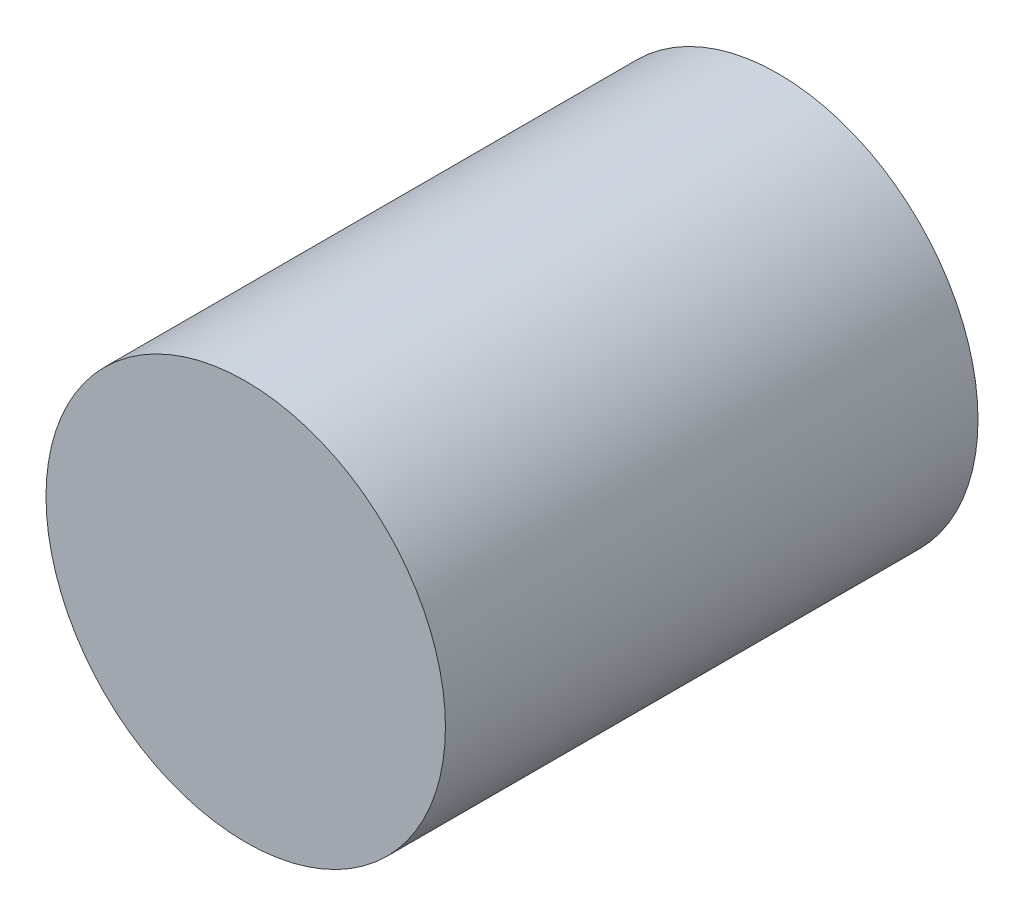
ISO-10303-21;
HEADER;
FILE_DESCRIPTION(('STEP AP214'),'2;1');
FILE_NAME('part.step','',(''),(''),'','','');
FILE_SCHEMA(('AUTOMOTIVE_DESIGN { 1 0 10303 214 1 1 1 1 }'));
ENDSEC;
DATA;
#1=APPLICATION_CONTEXT('core data for automotive mechanical design processes');
#2=APPLICATION_PROTOCOL_DEFINITION('international standard','automotive_design',2000,#1);
#3=PRODUCT_CONTEXT('',#1,'mechanical');
#4=PRODUCT('Part','Part','',(#3));
#5=PRODUCT_RELATED_PRODUCT_CATEGORY('part','',(#4));
#6=PRODUCT_DEFINITION_FORMATION('','',#4);
#7=PRODUCT_DEFINITION_CONTEXT('part definition',#1,'design');
#8=PRODUCT_DEFINITION('design','',#6,#7);
#9=PRODUCT_DEFINITION_SHAPE('','',#8);
#10=(LENGTH_UNIT() NAMED_UNIT(*) SI_UNIT(.MILLI.,.METRE.));
#11=(NAMED_UNIT(*) PLANE_ANGLE_UNIT() SI_UNIT($,.RADIAN.));
#12=(NAMED_UNIT(*) SI_UNIT($,.STERADIAN.) SOLID_ANGLE_UNIT());
#13=UNCERTAINTY_MEASURE_WITH_UNIT(LENGTH_MEASURE(1.E-05),#10,'distance_accuracy_value','');
#14=(GEOMETRIC_REPRESENTATION_CONTEXT(3) GLOBAL_UNCERTAINTY_ASSIGNED_CONTEXT((#13)) GLOBAL_UNIT_ASSIGNED_CONTEXT((#10,
#11,#12)) REPRESENTATION_CONTEXT('',''));
#15=CARTESIAN_POINT('',(0.,0.,0.));
#16=DIRECTION('',(0.,0.,1.));
#17=DIRECTION('',(1.,0.,0.));
#18=AXIS2_PLACEMENT_3D('',#15,#16,#17);
#19=CARTESIAN_POINT('',(0.,0.,80.));
#20=DIRECTION('',(0.,0.,-1.));
#21=DIRECTION('',(-1.,0.,0.));
#22=AXIS2_PLACEMENT_3D('',#19,#20,#21);
#23=CYLINDRICAL_SURFACE('',#22,30.);
#24=CARTESIAN_POINT('',(0.,0.,80.));
#25=DIRECTION('',(0.,0.,1.));
#26=DIRECTION('',(1.,0.,0.));
#27=AXIS2_PLACEMENT_3D('',#24,#25,#26);
#28=CIRCLE('',#27,30.);
#29=CARTESIAN_POINT('',(30.,0.,80.));
#30=VERTEX_POINT('',#29);
#31=EDGE_CURVE('E10',#30,#30,#28,.T.);
#32=ORIENTED_EDGE('',*,*,#31,.F.);
#33=EDGE_LOOP('',(#32));
#34=FACE_BOUND('',#33,.T.);
#35=CARTESIAN_POINT('',(0.,0.,0.));
#36=DIRECTION('',(0.,0.,1.));
#37=DIRECTION('',(1.,0.,0.));
#38=AXIS2_PLACEMENT_3D('',#35,#36,#37);
#39=CIRCLE('',#38,30.);
#40=CARTESIAN_POINT('',(30.,0.,0.));
#41=VERTEX_POINT('',#40);
#42=EDGE_CURVE('E37',#41,#41,#39,.T.);
#43=ORIENTED_EDGE('',*,*,#42,.T.);
#44=EDGE_LOOP('',(#43));
#45=FACE_BOUND('',#44,.T.);
#46=ADVANCED_FACE('F40',(#34,#45),#23,.T.);
#47=CARTESIAN_POINT('',(0.,0.,80.));
#48=DIRECTION('',(0.,0.,1.));
#49=DIRECTION('',(1.,0.,0.));
#50=AXIS2_PLACEMENT_3D('',#47,#48,#49);
#51=PLANE('',#50);
#52=ORIENTED_EDGE('',*,*,#31,.T.);
#53=EDGE_LOOP('',(#52));
#54=FACE_BOUND('',#53,.T.);
#55=ADVANCED_FACE('F55',(#54),#51,.T.);
#56=CARTESIAN_POINT('',(0.,0.,0.));
#57=DIRECTION('',(0.,0.,1.));
#58=DIRECTION('',(1.,0.,0.));
#59=AXIS2_PLACEMENT_3D('',#56,#57,#58);
#60=PLANE('',#59);
#61=ORIENTED_EDGE('',*,*,#42,.F.);
#62=EDGE_LOOP('',(#61));
#63=FACE_BOUND('',#62,.T.);
#64=ADVANCED_FACE('F49',(#63),#60,.F.);
#65=CLOSED_SHELL('',(#46,#55,#64));
#66=MANIFOLD_SOLID_BREP('B2',#65);
#67=ADVANCED_BREP_SHAPE_REPRESENTATION('',(#18,#66),#14);
#68=SHAPE_DEFINITION_REPRESENTATION(#9,#67);
ENDSEC;
END-ISO-10303-21;
